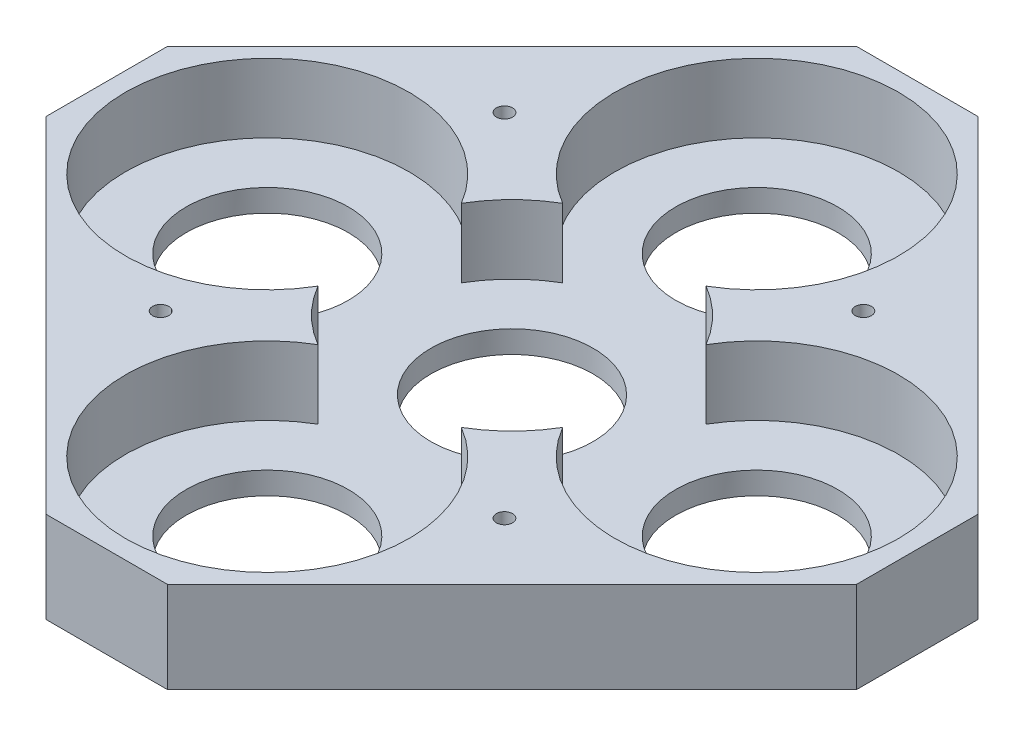
ISO-10303-21;
HEADER;
FILE_DESCRIPTION(('STEP AP214'),'2;1');
FILE_NAME('part.step','',(''),(''),'','','');
FILE_SCHEMA(('AUTOMOTIVE_DESIGN { 1 0 10303 214 1 1 1 1 }'));
ENDSEC;
DATA;
#1=APPLICATION_CONTEXT('core data for automotive mechanical design processes');
#2=APPLICATION_PROTOCOL_DEFINITION('international standard','automotive_design',2000,#1);
#3=PRODUCT_CONTEXT('',#1,'mechanical');
#4=PRODUCT('Part','Part','',(#3));
#5=PRODUCT_RELATED_PRODUCT_CATEGORY('part','',(#4));
#6=PRODUCT_DEFINITION_FORMATION('','',#4);
#7=PRODUCT_DEFINITION_CONTEXT('part definition',#1,'design');
#8=PRODUCT_DEFINITION('design','',#6,#7);
#9=PRODUCT_DEFINITION_SHAPE('','',#8);
#10=(LENGTH_UNIT() NAMED_UNIT(*) SI_UNIT(.MILLI.,.METRE.));
#11=(NAMED_UNIT(*) PLANE_ANGLE_UNIT() SI_UNIT($,.RADIAN.));
#12=(NAMED_UNIT(*) SI_UNIT($,.STERADIAN.) SOLID_ANGLE_UNIT());
#13=UNCERTAINTY_MEASURE_WITH_UNIT(LENGTH_MEASURE(1.E-05),#10,'distance_accuracy_value','');
#14=(GEOMETRIC_REPRESENTATION_CONTEXT(3) GLOBAL_UNCERTAINTY_ASSIGNED_CONTEXT((#13)) GLOBAL_UNIT_ASSIGNED_CONTEXT((#10,
#11,#12)) REPRESENTATION_CONTEXT('',''));
#15=CARTESIAN_POINT('',(0.,0.,0.));
#16=DIRECTION('',(0.,0.,1.));
#17=DIRECTION('',(1.,0.,0.));
#18=AXIS2_PLACEMENT_3D('',#15,#16,#17);
#19=CARTESIAN_POINT('',(0.,28.575,0.));
#20=DIRECTION('',(1.,0.,0.));
#21=DIRECTION('',(0.,0.,-1.));
#22=AXIS2_PLACEMENT_3D('',#19,#20,#21);
#23=PLANE('',#22);
#24=DIRECTION('',(0.,0.,1.));
#25=VECTOR('',#24,1.);
#26=CARTESIAN_POINT('',(0.,0.,0.));
#27=LINE('',#26,#25);
#28=CARTESIAN_POINT('',(0.,0.,-146.05));
#29=VERTEX_POINT('',#28);
#30=CARTESIAN_POINT('',(0.,0.,-107.95));
#31=VERTEX_POINT('',#30);
#32=EDGE_CURVE('E243',#29,#31,#27,.T.);
#33=ORIENTED_EDGE('',*,*,#32,.T.);
#34=DIRECTION('',(0.,1.,0.));
#35=VECTOR('',#34,1.);
#36=CARTESIAN_POINT('',(0.,28.575,-107.95));
#37=LINE('',#36,#35);
#38=CARTESIAN_POINT('',(0.,28.575,-107.95));
#39=VERTEX_POINT('',#38);
#40=EDGE_CURVE('E315',#31,#39,#37,.T.);
#41=ORIENTED_EDGE('',*,*,#40,.T.);
#42=DIRECTION('',(0.,0.,1.));
#43=VECTOR('',#42,1.);
#44=CARTESIAN_POINT('',(0.,28.575,0.));
#45=LINE('',#44,#43);
#46=CARTESIAN_POINT('',(0.,28.575,-146.05));
#47=VERTEX_POINT('',#46);
#48=EDGE_CURVE('E261',#47,#39,#45,.T.);
#49=ORIENTED_EDGE('',*,*,#48,.F.);
#50=DIRECTION('',(0.,-1.,0.));
#51=VECTOR('',#50,1.);
#52=CARTESIAN_POINT('',(0.,28.575,-146.05));
#53=LINE('',#52,#51);
#54=EDGE_CURVE('E311',#47,#29,#53,.T.);
#55=ORIENTED_EDGE('',*,*,#54,.T.);
#56=EDGE_LOOP('',(#33,#41,#49,#55));
#57=FACE_BOUND('',#56,.T.);
#58=ADVANCED_FACE('F43',(#57),#23,.F.);
#59=CARTESIAN_POINT('',(0.,28.575,0.));
#60=DIRECTION('',(0.,0.,-1.));
#61=DIRECTION('',(-1.,0.,0.));
#62=AXIS2_PLACEMENT_3D('',#59,#60,#61);
#63=PLANE('',#62);
#64=DIRECTION('',(1.,0.,0.));
#65=VECTOR('',#64,1.);
#66=CARTESIAN_POINT('',(0.,28.575,0.));
#67=LINE('',#66,#65);
#68=CARTESIAN_POINT('',(107.95,28.575,0.));
#69=VERTEX_POINT('',#68);
#70=CARTESIAN_POINT('',(146.05,28.575,0.));
#71=VERTEX_POINT('',#70);
#72=EDGE_CURVE('E265',#69,#71,#67,.T.);
#73=ORIENTED_EDGE('',*,*,#72,.F.);
#74=DIRECTION('',(0.,-1.,0.));
#75=VECTOR('',#74,1.);
#76=CARTESIAN_POINT('',(107.95,28.575,0.));
#77=LINE('',#76,#75);
#78=CARTESIAN_POINT('',(107.95,0.,0.));
#79=VERTEX_POINT('',#78);
#80=EDGE_CURVE('E295',#69,#79,#77,.T.);
#81=ORIENTED_EDGE('',*,*,#80,.T.);
#82=DIRECTION('',(1.,0.,0.));
#83=VECTOR('',#82,1.);
#84=CARTESIAN_POINT('',(0.,0.,0.));
#85=LINE('',#84,#83);
#86=CARTESIAN_POINT('',(146.05,0.,0.));
#87=VERTEX_POINT('',#86);
#88=EDGE_CURVE('E280',#79,#87,#85,.T.);
#89=ORIENTED_EDGE('',*,*,#88,.T.);
#90=DIRECTION('',(0.,1.,0.));
#91=VECTOR('',#90,1.);
#92=CARTESIAN_POINT('',(146.05,28.575,0.));
#93=LINE('',#92,#91);
#94=EDGE_CURVE('E276',#87,#71,#93,.T.);
#95=ORIENTED_EDGE('',*,*,#94,.T.);
#96=EDGE_LOOP('',(#73,#81,#89,#95));
#97=FACE_BOUND('',#96,.T.);
#98=ADVANCED_FACE('F367',(#97),#63,.F.);
#99=CARTESIAN_POINT('',(254.,28.575,0.));
#100=DIRECTION('',(-1.,0.,0.));
#101=DIRECTION('',(0.,0.,1.));
#102=AXIS2_PLACEMENT_3D('',#99,#100,#101);
#103=PLANE('',#102);
#104=DIRECTION('',(0.,0.,-1.));
#105=VECTOR('',#104,1.);
#106=CARTESIAN_POINT('',(254.,0.,0.));
#107=LINE('',#106,#105);
#108=CARTESIAN_POINT('',(254.,0.,-107.95));
#109=VERTEX_POINT('',#108);
#110=CARTESIAN_POINT('',(254.,0.,-146.05));
#111=VERTEX_POINT('',#110);
#112=EDGE_CURVE('E284',#109,#111,#107,.T.);
#113=ORIENTED_EDGE('',*,*,#112,.T.);
#114=DIRECTION('',(0.,1.,0.));
#115=VECTOR('',#114,1.);
#116=CARTESIAN_POINT('',(254.,28.575,-146.05));
#117=LINE('',#116,#115);
#118=CARTESIAN_POINT('',(254.,28.575,-146.05));
#119=VERTEX_POINT('',#118);
#120=EDGE_CURVE('E13',#111,#119,#117,.T.);
#121=ORIENTED_EDGE('',*,*,#120,.T.);
#122=DIRECTION('',(0.,0.,-1.));
#123=VECTOR('',#122,1.);
#124=CARTESIAN_POINT('',(254.,28.575,0.));
#125=LINE('',#124,#123);
#126=CARTESIAN_POINT('',(254.,28.575,-107.95));
#127=VERTEX_POINT('',#126);
#128=EDGE_CURVE('E270',#127,#119,#125,.T.);
#129=ORIENTED_EDGE('',*,*,#128,.F.);
#130=DIRECTION('',(0.,-1.,0.));
#131=VECTOR('',#130,1.);
#132=CARTESIAN_POINT('',(254.,28.575,-107.95));
#133=LINE('',#132,#131);
#134=EDGE_CURVE('E52',#127,#109,#133,.T.);
#135=ORIENTED_EDGE('',*,*,#134,.T.);
#136=EDGE_LOOP('',(#113,#121,#129,#135));
#137=FACE_BOUND('',#136,.T.);
#138=ADVANCED_FACE('F340',(#137),#103,.F.);
#139=CARTESIAN_POINT('',(0.,28.575,-254.));
#140=DIRECTION('',(0.,0.,1.));
#141=DIRECTION('',(1.,0.,0.));
#142=AXIS2_PLACEMENT_3D('',#139,#140,#141);
#143=PLANE('',#142);
#144=DIRECTION('',(-1.,0.,0.));
#145=VECTOR('',#144,1.);
#146=CARTESIAN_POINT('',(0.,0.,-254.));
#147=LINE('',#146,#145);
#148=CARTESIAN_POINT('',(146.05,0.,-254.));
#149=VERTEX_POINT('',#148);
#150=CARTESIAN_POINT('',(107.95,0.,-254.));
#151=VERTEX_POINT('',#150);
#152=EDGE_CURVE('E266',#149,#151,#147,.T.);
#153=ORIENTED_EDGE('',*,*,#152,.T.);
#154=DIRECTION('',(0.,1.,0.));
#155=VECTOR('',#154,1.);
#156=CARTESIAN_POINT('',(107.95,28.575,-254.));
#157=LINE('',#156,#155);
#158=CARTESIAN_POINT('',(107.95,28.575,-254.));
#159=VERTEX_POINT('',#158);
#160=EDGE_CURVE('E59',#151,#159,#157,.T.);
#161=ORIENTED_EDGE('',*,*,#160,.T.);
#162=DIRECTION('',(-1.,0.,0.));
#163=VECTOR('',#162,1.);
#164=CARTESIAN_POINT('',(0.,28.575,-254.));
#165=LINE('',#164,#163);
#166=CARTESIAN_POINT('',(146.05,28.575,-254.));
#167=VERTEX_POINT('',#166);
#168=EDGE_CURVE('E273',#167,#159,#165,.T.);
#169=ORIENTED_EDGE('',*,*,#168,.F.);
#170=DIRECTION('',(0.,-1.,0.));
#171=VECTOR('',#170,1.);
#172=CARTESIAN_POINT('',(146.05,28.575,-254.));
#173=LINE('',#172,#171);
#174=EDGE_CURVE('E329',#167,#149,#173,.T.);
#175=ORIENTED_EDGE('',*,*,#174,.T.);
#176=EDGE_LOOP('',(#153,#161,#169,#175));
#177=FACE_BOUND('',#176,.T.);
#178=ADVANCED_FACE('F351',(#177),#143,.F.);
#179=CARTESIAN_POINT('',(0.,28.575,0.));
#180=DIRECTION('',(0.,-1.,0.));
#181=DIRECTION('',(0.,0.,-1.));
#182=AXIS2_PLACEMENT_3D('',#179,#180,#181);
#183=PLANE('',#182);
#184=CARTESIAN_POINT('',(70.7525612106915,28.575,-180.881536726415));
#185=DIRECTION('',(0.,1.,0.));
#186=DIRECTION('',(0.,0.,1.));
#187=AXIS2_PLACEMENT_3D('',#184,#185,#186);
#188=CIRCLE('',#187,2.52729999999998);
#189=CARTESIAN_POINT('',(70.7525612106915,28.575,-178.354236726415));
#190=VERTEX_POINT('',#189);
#191=EDGE_CURVE('E756',#190,#190,#188,.T.);
#192=ORIENTED_EDGE('',*,*,#191,.F.);
#193=EDGE_LOOP('',(#192));
#194=FACE_BOUND('',#193,.T.);
#195=CARTESIAN_POINT('',(70.7525612106915,28.575,-73.1184632735851));
#196=DIRECTION('',(0.,1.,0.));
#197=DIRECTION('',(0.,0.,1.));
#198=AXIS2_PLACEMENT_3D('',#195,#196,#197);
#199=CIRCLE('',#198,2.52729999999998);
#200=CARTESIAN_POINT('',(70.7525612106915,28.575,-70.5911632735851));
#201=VERTEX_POINT('',#200);
#202=EDGE_CURVE('E748',#201,#201,#199,.T.);
#203=ORIENTED_EDGE('',*,*,#202,.F.);
#204=EDGE_LOOP('',(#203));
#205=FACE_BOUND('',#204,.T.);
#206=CARTESIAN_POINT('',(180.881536726415,28.575,-70.7525612106915));
#207=DIRECTION('',(0.,1.,0.));
#208=DIRECTION('',(0.,0.,1.));
#209=AXIS2_PLACEMENT_3D('',#206,#207,#208);
#210=CIRCLE('',#209,2.52729999999998);
#211=CARTESIAN_POINT('',(180.881536726415,28.575,-68.2252612106915));
#212=VERTEX_POINT('',#211);
#213=EDGE_CURVE('E740',#212,#212,#210,.T.);
#214=ORIENTED_EDGE('',*,*,#213,.F.);
#215=EDGE_LOOP('',(#214));
#216=FACE_BOUND('',#215,.T.);
#217=CARTESIAN_POINT('',(180.881536726415,28.575,-183.247438789308));
#218=DIRECTION('',(0.,1.,0.));
#219=DIRECTION('',(0.,0.,1.));
#220=AXIS2_PLACEMENT_3D('',#217,#218,#219);
#221=CIRCLE('',#220,2.52729999999998);
#222=CARTESIAN_POINT('',(180.881536726415,28.575,-180.720138789309));
#223=VERTEX_POINT('',#222);
#224=EDGE_CURVE('E730',#223,#223,#221,.T.);
#225=ORIENTED_EDGE('',*,*,#224,.F.);
#226=EDGE_LOOP('',(#225));
#227=FACE_BOUND('',#226,.T.);
#228=CARTESIAN_POINT('',(127.,28.575,-127.));
#229=DIRECTION('',(0.,1.,0.));
#230=DIRECTION('',(0.,0.,1.));
#231=AXIS2_PLACEMENT_3D('',#228,#229,#230);
#232=CIRCLE('',#231,44.45);
#233=CARTESIAN_POINT('',(165.354,28.575,-149.467157897696));
#234=VERTEX_POINT('',#233);
#235=CARTESIAN_POINT('',(149.467157897696,28.575,-165.354));
#236=VERTEX_POINT('',#235);
#237=EDGE_CURVE('E217',#234,#236,#232,.T.);
#238=ORIENTED_EDGE('',*,*,#237,.F.);
#239=CARTESIAN_POINT('',(203.708,28.575,-127.));
#240=DIRECTION('',(0.,1.,0.));
#241=DIRECTION('',(0.,0.,1.));
#242=AXIS2_PLACEMENT_3D('',#239,#240,#241);
#243=CIRCLE('',#242,44.45);
#244=CARTESIAN_POINT('',(165.354,28.575,-104.532842102304));
#245=VERTEX_POINT('',#244);
#246=EDGE_CURVE('E165',#245,#234,#243,.T.);
#247=ORIENTED_EDGE('',*,*,#246,.F.);
#248=CARTESIAN_POINT('',(127.,28.575,-127.));
#249=DIRECTION('',(0.,1.,0.));
#250=DIRECTION('',(0.,0.,1.));
#251=AXIS2_PLACEMENT_3D('',#248,#249,#250);
#252=CIRCLE('',#251,44.45);
#253=CARTESIAN_POINT('',(149.467157897696,28.575,-88.646));
#254=VERTEX_POINT('',#253);
#255=EDGE_CURVE('E186',#254,#245,#252,.T.);
#256=ORIENTED_EDGE('',*,*,#255,.F.);
#257=CARTESIAN_POINT('',(127.,28.575,-50.292));
#258=DIRECTION('',(0.,1.,0.));
#259=DIRECTION('',(0.,0.,1.));
#260=AXIS2_PLACEMENT_3D('',#257,#258,#259);
#261=CIRCLE('',#260,44.45);
#262=CARTESIAN_POINT('',(104.532842102304,28.575,-88.646));
#263=VERTEX_POINT('',#262);
#264=EDGE_CURVE('E190',#263,#254,#261,.T.);
#265=ORIENTED_EDGE('',*,*,#264,.F.);
#266=CARTESIAN_POINT('',(127.,28.575,-127.));
#267=DIRECTION('',(0.,1.,0.));
#268=DIRECTION('',(0.,0.,1.));
#269=AXIS2_PLACEMENT_3D('',#266,#267,#268);
#270=CIRCLE('',#269,44.45);
#271=CARTESIAN_POINT('',(88.646,28.575,-104.532842102304));
#272=VERTEX_POINT('',#271);
#273=EDGE_CURVE('E233',#272,#263,#270,.T.);
#274=ORIENTED_EDGE('',*,*,#273,.F.);
#275=CARTESIAN_POINT('',(50.292,28.575,-127.));
#276=DIRECTION('',(0.,1.,0.));
#277=DIRECTION('',(0.,0.,1.));
#278=AXIS2_PLACEMENT_3D('',#275,#276,#277);
#279=CIRCLE('',#278,44.45);
#280=CARTESIAN_POINT('',(88.646,28.575,-149.467157897696));
#281=VERTEX_POINT('',#280);
#282=EDGE_CURVE('E229',#281,#272,#279,.T.);
#283=ORIENTED_EDGE('',*,*,#282,.F.);
#284=CARTESIAN_POINT('',(127.,28.575,-127.));
#285=DIRECTION('',(0.,1.,0.));
#286=DIRECTION('',(0.,0.,1.));
#287=AXIS2_PLACEMENT_3D('',#284,#285,#286);
#288=CIRCLE('',#287,44.45);
#289=CARTESIAN_POINT('',(104.532842102304,28.575,-165.354));
#290=VERTEX_POINT('',#289);
#291=EDGE_CURVE('E225',#290,#281,#288,.T.);
#292=ORIENTED_EDGE('',*,*,#291,.F.);
#293=CARTESIAN_POINT('',(127.,28.575,-203.708));
#294=DIRECTION('',(0.,1.,0.));
#295=DIRECTION('',(0.,0.,1.));
#296=AXIS2_PLACEMENT_3D('',#293,#294,#295);
#297=CIRCLE('',#296,44.45);
#298=EDGE_CURVE('E221',#236,#290,#297,.T.);
#299=ORIENTED_EDGE('',*,*,#298,.F.);
#300=EDGE_LOOP('',(#238,#247,#256,#265,#274,#283,#292,#299));
#301=FACE_BOUND('',#300,.T.);
#302=ORIENTED_EDGE('',*,*,#48,.T.);
#303=DIRECTION('',(-0.707106781186548,0.,-0.707106781186548));
#304=VECTOR('',#303,1.);
#305=CARTESIAN_POINT('',(107.95,28.575,0.));
#306=LINE('',#305,#304);
#307=EDGE_CURVE('E326',#39,#69,#306,.F.);
#308=ORIENTED_EDGE('',*,*,#307,.T.);
#309=ORIENTED_EDGE('',*,*,#72,.T.);
#310=DIRECTION('',(-0.707106781186548,0.,0.707106781186548));
#311=VECTOR('',#310,1.);
#312=CARTESIAN_POINT('',(254.,28.575,-107.95));
#313=LINE('',#312,#311);
#314=EDGE_CURVE('E318',#71,#127,#313,.F.);
#315=ORIENTED_EDGE('',*,*,#314,.T.);
#316=ORIENTED_EDGE('',*,*,#128,.T.);
#317=DIRECTION('',(0.707106781186548,0.,0.707106781186548));
#318=VECTOR('',#317,1.);
#319=CARTESIAN_POINT('',(146.05,28.575,-254.));
#320=LINE('',#319,#318);
#321=EDGE_CURVE('E66',#119,#167,#320,.F.);
#322=ORIENTED_EDGE('',*,*,#321,.T.);
#323=ORIENTED_EDGE('',*,*,#168,.T.);
#324=DIRECTION('',(0.707106781186548,0.,-0.707106781186548));
#325=VECTOR('',#324,1.);
#326=CARTESIAN_POINT('',(0.,28.575,-146.05));
#327=LINE('',#326,#325);
#328=EDGE_CURVE('E323',#159,#47,#327,.F.);
#329=ORIENTED_EDGE('',*,*,#328,.T.);
#330=EDGE_LOOP('',(#302,#308,#309,#315,#316,#322,#323,#329));
#331=FACE_BOUND('',#330,.T.);
#332=ADVANCED_FACE('F353',(#194,#205,#216,#227,#301,#331),#183,.F.);
#333=CARTESIAN_POINT('',(0.,0.,0.));
#334=DIRECTION('',(0.,-1.,0.));
#335=DIRECTION('',(0.,0.,-1.));
#336=AXIS2_PLACEMENT_3D('',#333,#334,#335);
#337=PLANE('',#336);
#338=CARTESIAN_POINT('',(70.7525612106915,0.,-180.881536726415));
#339=DIRECTION('',(0.,1.,0.));
#340=DIRECTION('',(0.,0.,1.));
#341=AXIS2_PLACEMENT_3D('',#338,#339,#340);
#342=CIRCLE('',#341,2.5273);
#343=CARTESIAN_POINT('',(70.7525612106915,0.,-178.354236726415));
#344=VERTEX_POINT('',#343);
#345=EDGE_CURVE('E752',#344,#344,#342,.T.);
#346=ORIENTED_EDGE('',*,*,#345,.T.);
#347=EDGE_LOOP('',(#346));
#348=FACE_BOUND('',#347,.T.);
#349=CARTESIAN_POINT('',(70.7525612106915,0.,-73.1184632735851));
#350=DIRECTION('',(0.,1.,0.));
#351=DIRECTION('',(0.,0.,1.));
#352=AXIS2_PLACEMENT_3D('',#349,#350,#351);
#353=CIRCLE('',#352,2.5273);
#354=CARTESIAN_POINT('',(70.7525612106915,0.,-70.5911632735851));
#355=VERTEX_POINT('',#354);
#356=EDGE_CURVE('E744',#355,#355,#353,.T.);
#357=ORIENTED_EDGE('',*,*,#356,.T.);
#358=EDGE_LOOP('',(#357));
#359=FACE_BOUND('',#358,.T.);
#360=CARTESIAN_POINT('',(180.881536726415,0.,-70.7525612106915));
#361=DIRECTION('',(0.,1.,0.));
#362=DIRECTION('',(0.,0.,1.));
#363=AXIS2_PLACEMENT_3D('',#360,#361,#362);
#364=CIRCLE('',#363,2.52729999999998);
#365=CARTESIAN_POINT('',(180.881536726415,0.,-68.2252612106915));
#366=VERTEX_POINT('',#365);
#367=EDGE_CURVE('E736',#366,#366,#364,.T.);
#368=ORIENTED_EDGE('',*,*,#367,.T.);
#369=EDGE_LOOP('',(#368));
#370=FACE_BOUND('',#369,.T.);
#371=CARTESIAN_POINT('',(180.881536726415,0.,-183.247438789308));
#372=DIRECTION('',(0.,1.,0.));
#373=DIRECTION('',(0.,0.,1.));
#374=AXIS2_PLACEMENT_3D('',#371,#372,#373);
#375=CIRCLE('',#374,2.52729999999998);
#376=CARTESIAN_POINT('',(180.881536726415,0.,-180.720138789309));
#377=VERTEX_POINT('',#376);
#378=EDGE_CURVE('E724',#377,#377,#375,.T.);
#379=ORIENTED_EDGE('',*,*,#378,.T.);
#380=EDGE_LOOP('',(#379));
#381=FACE_BOUND('',#380,.T.);
#382=CARTESIAN_POINT('',(127.,0.,-50.292));
#383=DIRECTION('',(0.,-1.,0.));
#384=DIRECTION('',(0.,0.,-1.));
#385=AXIS2_PLACEMENT_3D('',#382,#383,#384);
#386=CIRCLE('',#385,25.4);
#387=CARTESIAN_POINT('',(127.,0.,-75.692));
#388=VERTEX_POINT('',#387);
#389=EDGE_CURVE('E193',#388,#388,#386,.T.);
#390=ORIENTED_EDGE('',*,*,#389,.F.);
#391=EDGE_LOOP('',(#390));
#392=FACE_BOUND('',#391,.T.);
#393=CARTESIAN_POINT('',(50.292,0.,-127.));
#394=DIRECTION('',(0.,-1.,0.));
#395=DIRECTION('',(0.,0.,-1.));
#396=AXIS2_PLACEMENT_3D('',#393,#394,#395);
#397=CIRCLE('',#396,25.4);
#398=CARTESIAN_POINT('',(50.292,0.,-152.4));
#399=VERTEX_POINT('',#398);
#400=EDGE_CURVE('E706',#399,#399,#397,.T.);
#401=ORIENTED_EDGE('',*,*,#400,.F.);
#402=EDGE_LOOP('',(#401));
#403=FACE_BOUND('',#402,.T.);
#404=CARTESIAN_POINT('',(127.,0.,-203.708));
#405=DIRECTION('',(0.,-1.,0.));
#406=DIRECTION('',(0.,0.,-1.));
#407=AXIS2_PLACEMENT_3D('',#404,#405,#406);
#408=CIRCLE('',#407,25.4);
#409=CARTESIAN_POINT('',(127.,0.,-229.108));
#410=VERTEX_POINT('',#409);
#411=EDGE_CURVE('E699',#410,#410,#408,.T.);
#412=ORIENTED_EDGE('',*,*,#411,.F.);
#413=EDGE_LOOP('',(#412));
#414=FACE_BOUND('',#413,.T.);
#415=CARTESIAN_POINT('',(203.708,0.,-127.));
#416=DIRECTION('',(0.,-1.,0.));
#417=DIRECTION('',(0.,0.,-1.));
#418=AXIS2_PLACEMENT_3D('',#415,#416,#417);
#419=CIRCLE('',#418,25.4);
#420=CARTESIAN_POINT('',(203.708,0.,-152.4));
#421=VERTEX_POINT('',#420);
#422=EDGE_CURVE('E218',#421,#421,#419,.T.);
#423=ORIENTED_EDGE('',*,*,#422,.F.);
#424=EDGE_LOOP('',(#423));
#425=FACE_BOUND('',#424,.T.);
#426=CARTESIAN_POINT('',(127.,0.,-127.));
#427=DIRECTION('',(0.,-1.,0.));
#428=DIRECTION('',(0.,0.,-1.));
#429=AXIS2_PLACEMENT_3D('',#426,#427,#428);
#430=CIRCLE('',#429,25.4);
#431=CARTESIAN_POINT('',(127.,0.,-152.4));
#432=VERTEX_POINT('',#431);
#433=EDGE_CURVE('E694',#432,#432,#430,.T.);
#434=ORIENTED_EDGE('',*,*,#433,.F.);
#435=EDGE_LOOP('',(#434));
#436=FACE_BOUND('',#435,.T.);
#437=ORIENTED_EDGE('',*,*,#88,.F.);
#438=DIRECTION('',(0.707106781186548,0.,0.707106781186548));
#439=VECTOR('',#438,1.);
#440=CARTESIAN_POINT('',(53.975,0.,-53.975));
#441=LINE('',#440,#439);
#442=EDGE_CURVE('E308',#79,#31,#441,.F.);
#443=ORIENTED_EDGE('',*,*,#442,.T.);
#444=ORIENTED_EDGE('',*,*,#32,.F.);
#445=DIRECTION('',(-0.707106781186548,0.,0.707106781186548));
#446=VECTOR('',#445,1.);
#447=CARTESIAN_POINT('',(-73.025,0.,-73.025));
#448=LINE('',#447,#446);
#449=EDGE_CURVE('E305',#29,#151,#448,.F.);
#450=ORIENTED_EDGE('',*,*,#449,.T.);
#451=ORIENTED_EDGE('',*,*,#152,.F.);
#452=DIRECTION('',(-0.707106781186548,0.,-0.707106781186548));
#453=VECTOR('',#452,1.);
#454=CARTESIAN_POINT('',(200.025,0.,-200.025));
#455=LINE('',#454,#453);
#456=EDGE_CURVE('E302',#149,#111,#455,.F.);
#457=ORIENTED_EDGE('',*,*,#456,.T.);
#458=ORIENTED_EDGE('',*,*,#112,.F.);
#459=DIRECTION('',(0.707106781186548,0.,-0.707106781186548));
#460=VECTOR('',#459,1.);
#461=CARTESIAN_POINT('',(73.025,0.,73.025));
#462=LINE('',#461,#460);
#463=EDGE_CURVE('E299',#109,#87,#462,.F.);
#464=ORIENTED_EDGE('',*,*,#463,.T.);
#465=EDGE_LOOP('',(#437,#443,#444,#450,#451,#457,#458,#464));
#466=FACE_BOUND('',#465,.T.);
#467=ADVANCED_FACE('F346',(#348,#359,#370,#381,#392,#403,#414,#425,#436,#466),#337,.T.);
#468=CARTESIAN_POINT('',(203.708,6.985,-127.));
#469=DIRECTION('',(0.,1.,0.));
#470=DIRECTION('',(0.,0.,1.));
#471=AXIS2_PLACEMENT_3D('',#468,#469,#470);
#472=CYLINDRICAL_SURFACE('',#471,44.45);
#473=ORIENTED_EDGE('',*,*,#246,.T.);
#474=DIRECTION('',(0.,1.,0.));
#475=VECTOR('',#474,1.);
#476=CARTESIAN_POINT('',(165.354,6.985,-149.467157897696));
#477=LINE('',#476,#475);
#478=CARTESIAN_POINT('',(165.354,6.985,-149.467157897696));
#479=VERTEX_POINT('',#478);
#480=EDGE_CURVE('E158',#479,#234,#477,.T.);
#481=ORIENTED_EDGE('',*,*,#480,.F.);
#482=CARTESIAN_POINT('',(203.708,6.985,-127.));
#483=DIRECTION('',(0.,1.,0.));
#484=DIRECTION('',(0.,0.,1.));
#485=AXIS2_PLACEMENT_3D('',#482,#483,#484);
#486=CIRCLE('',#485,44.45);
#487=CARTESIAN_POINT('',(165.354,6.985,-104.532842102304));
#488=VERTEX_POINT('',#487);
#489=EDGE_CURVE('E162',#488,#479,#486,.T.);
#490=ORIENTED_EDGE('',*,*,#489,.F.);
#491=DIRECTION('',(0.,1.,0.));
#492=VECTOR('',#491,1.);
#493=CARTESIAN_POINT('',(165.354,6.985,-104.532842102304));
#494=LINE('',#493,#492);
#495=EDGE_CURVE('E240',#488,#245,#494,.T.);
#496=ORIENTED_EDGE('',*,*,#495,.T.);
#497=EDGE_LOOP('',(#473,#481,#490,#496));
#498=FACE_BOUND('',#497,.T.);
#499=ADVANCED_FACE('F160',(#498),#472,.F.);
#500=CARTESIAN_POINT('',(127.,6.985,-127.));
#501=DIRECTION('',(0.,1.,0.));
#502=DIRECTION('',(0.,0.,1.));
#503=AXIS2_PLACEMENT_3D('',#500,#501,#502);
#504=CYLINDRICAL_SURFACE('',#503,44.45);
#505=ORIENTED_EDGE('',*,*,#255,.T.);
#506=ORIENTED_EDGE('',*,*,#495,.F.);
#507=CARTESIAN_POINT('',(127.,6.985,-127.));
#508=DIRECTION('',(0.,1.,0.));
#509=DIRECTION('',(0.,0.,1.));
#510=AXIS2_PLACEMENT_3D('',#507,#508,#509);
#511=CIRCLE('',#510,44.45);
#512=CARTESIAN_POINT('',(149.467157897696,6.985,-88.646));
#513=VERTEX_POINT('',#512);
#514=EDGE_CURVE('E171',#513,#488,#511,.T.);
#515=ORIENTED_EDGE('',*,*,#514,.F.);
#516=DIRECTION('',(0.,1.,0.));
#517=VECTOR('',#516,1.);
#518=CARTESIAN_POINT('',(149.467157897696,6.985,-88.646));
#519=LINE('',#518,#517);
#520=EDGE_CURVE('E244',#513,#254,#519,.T.);
#521=ORIENTED_EDGE('',*,*,#520,.T.);
#522=EDGE_LOOP('',(#505,#506,#515,#521));
#523=FACE_BOUND('',#522,.T.);
#524=ADVANCED_FACE('F488',(#523),#504,.F.);
#525=CARTESIAN_POINT('',(127.,6.985,-50.292));
#526=DIRECTION('',(0.,1.,0.));
#527=DIRECTION('',(0.,0.,1.));
#528=AXIS2_PLACEMENT_3D('',#525,#526,#527);
#529=CYLINDRICAL_SURFACE('',#528,44.45);
#530=ORIENTED_EDGE('',*,*,#264,.T.);
#531=ORIENTED_EDGE('',*,*,#520,.F.);
#532=CARTESIAN_POINT('',(127.,6.985,-50.292));
#533=DIRECTION('',(0.,1.,0.));
#534=DIRECTION('',(0.,0.,1.));
#535=AXIS2_PLACEMENT_3D('',#532,#533,#534);
#536=CIRCLE('',#535,44.45);
#537=CARTESIAN_POINT('',(104.532842102304,6.985,-88.646));
#538=VERTEX_POINT('',#537);
#539=EDGE_CURVE('E210',#538,#513,#536,.T.);
#540=ORIENTED_EDGE('',*,*,#539,.F.);
#541=DIRECTION('',(0.,1.,0.));
#542=VECTOR('',#541,1.);
#543=CARTESIAN_POINT('',(104.532842102304,6.985,-88.646));
#544=LINE('',#543,#542);
#545=EDGE_CURVE('E247',#538,#263,#544,.T.);
#546=ORIENTED_EDGE('',*,*,#545,.T.);
#547=EDGE_LOOP('',(#530,#531,#540,#546));
#548=FACE_BOUND('',#547,.T.);
#549=ADVANCED_FACE('F491',(#548),#529,.F.);
#550=CARTESIAN_POINT('',(127.,6.985,-127.));
#551=DIRECTION('',(0.,1.,0.));
#552=DIRECTION('',(0.,0.,1.));
#553=AXIS2_PLACEMENT_3D('',#550,#551,#552);
#554=CYLINDRICAL_SURFACE('',#553,44.45);
#555=ORIENTED_EDGE('',*,*,#273,.T.);
#556=ORIENTED_EDGE('',*,*,#545,.F.);
#557=CARTESIAN_POINT('',(127.,6.985,-127.));
#558=DIRECTION('',(0.,1.,0.));
#559=DIRECTION('',(0.,0.,1.));
#560=AXIS2_PLACEMENT_3D('',#557,#558,#559);
#561=CIRCLE('',#560,44.45);
#562=CARTESIAN_POINT('',(88.646,6.985,-104.532842102304));
#563=VERTEX_POINT('',#562);
#564=EDGE_CURVE('E206',#563,#538,#561,.T.);
#565=ORIENTED_EDGE('',*,*,#564,.F.);
#566=DIRECTION('',(0.,1.,0.));
#567=VECTOR('',#566,1.);
#568=CARTESIAN_POINT('',(88.646,6.985,-104.532842102304));
#569=LINE('',#568,#567);
#570=EDGE_CURVE('E250',#563,#272,#569,.T.);
#571=ORIENTED_EDGE('',*,*,#570,.T.);
#572=EDGE_LOOP('',(#555,#556,#565,#571));
#573=FACE_BOUND('',#572,.T.);
#574=ADVANCED_FACE('F495',(#573),#554,.F.);
#575=CARTESIAN_POINT('',(50.292,6.985,-127.));
#576=DIRECTION('',(0.,1.,0.));
#577=DIRECTION('',(0.,0.,1.));
#578=AXIS2_PLACEMENT_3D('',#575,#576,#577);
#579=CYLINDRICAL_SURFACE('',#578,44.45);
#580=ORIENTED_EDGE('',*,*,#282,.T.);
#581=ORIENTED_EDGE('',*,*,#570,.F.);
#582=CARTESIAN_POINT('',(50.292,6.985,-127.));
#583=DIRECTION('',(0.,1.,0.));
#584=DIRECTION('',(0.,0.,1.));
#585=AXIS2_PLACEMENT_3D('',#582,#583,#584);
#586=CIRCLE('',#585,44.45);
#587=CARTESIAN_POINT('',(88.646,6.985,-149.467157897696));
#588=VERTEX_POINT('',#587);
#589=EDGE_CURVE('E202',#588,#563,#586,.T.);
#590=ORIENTED_EDGE('',*,*,#589,.F.);
#591=DIRECTION('',(0.,1.,0.));
#592=VECTOR('',#591,1.);
#593=CARTESIAN_POINT('',(88.646,6.985,-149.467157897696));
#594=LINE('',#593,#592);
#595=EDGE_CURVE('E253',#588,#281,#594,.T.);
#596=ORIENTED_EDGE('',*,*,#595,.T.);
#597=EDGE_LOOP('',(#580,#581,#590,#596));
#598=FACE_BOUND('',#597,.T.);
#599=ADVANCED_FACE('F499',(#598),#579,.F.);
#600=CARTESIAN_POINT('',(127.,6.985,-127.));
#601=DIRECTION('',(0.,1.,0.));
#602=DIRECTION('',(0.,0.,1.));
#603=AXIS2_PLACEMENT_3D('',#600,#601,#602);
#604=CYLINDRICAL_SURFACE('',#603,44.45);
#605=ORIENTED_EDGE('',*,*,#291,.T.);
#606=ORIENTED_EDGE('',*,*,#595,.F.);
#607=CARTESIAN_POINT('',(127.,6.985,-127.));
#608=DIRECTION('',(0.,1.,0.));
#609=DIRECTION('',(0.,0.,1.));
#610=AXIS2_PLACEMENT_3D('',#607,#608,#609);
#611=CIRCLE('',#610,44.45);
#612=CARTESIAN_POINT('',(104.532842102304,6.985,-165.354));
#613=VERTEX_POINT('',#612);
#614=EDGE_CURVE('E198',#613,#588,#611,.T.);
#615=ORIENTED_EDGE('',*,*,#614,.F.);
#616=DIRECTION('',(0.,1.,0.));
#617=VECTOR('',#616,1.);
#618=CARTESIAN_POINT('',(104.532842102304,6.985,-165.354));
#619=LINE('',#618,#617);
#620=EDGE_CURVE('E256',#613,#290,#619,.T.);
#621=ORIENTED_EDGE('',*,*,#620,.T.);
#622=EDGE_LOOP('',(#605,#606,#615,#621));
#623=FACE_BOUND('',#622,.T.);
#624=ADVANCED_FACE('F503',(#623),#604,.F.);
#625=CARTESIAN_POINT('',(127.,6.985,-203.708));
#626=DIRECTION('',(0.,1.,0.));
#627=DIRECTION('',(0.,0.,1.));
#628=AXIS2_PLACEMENT_3D('',#625,#626,#627);
#629=CYLINDRICAL_SURFACE('',#628,44.45);
#630=ORIENTED_EDGE('',*,*,#298,.T.);
#631=ORIENTED_EDGE('',*,*,#620,.F.);
#632=CARTESIAN_POINT('',(127.,6.985,-203.708));
#633=DIRECTION('',(0.,1.,0.));
#634=DIRECTION('',(0.,0.,1.));
#635=AXIS2_PLACEMENT_3D('',#632,#633,#634);
#636=CIRCLE('',#635,44.45);
#637=CARTESIAN_POINT('',(149.467157897696,6.985,-165.354));
#638=VERTEX_POINT('',#637);
#639=EDGE_CURVE('E180',#638,#613,#636,.T.);
#640=ORIENTED_EDGE('',*,*,#639,.F.);
#641=DIRECTION('',(0.,1.,0.));
#642=VECTOR('',#641,1.);
#643=CARTESIAN_POINT('',(149.467157897696,6.985,-165.354));
#644=LINE('',#643,#642);
#645=EDGE_CURVE('E170',#638,#236,#644,.T.);
#646=ORIENTED_EDGE('',*,*,#645,.T.);
#647=EDGE_LOOP('',(#630,#631,#640,#646));
#648=FACE_BOUND('',#647,.T.);
#649=ADVANCED_FACE('F507',(#648),#629,.F.);
#650=CARTESIAN_POINT('',(127.,6.985,-127.));
#651=DIRECTION('',(0.,1.,0.));
#652=DIRECTION('',(0.,0.,1.));
#653=AXIS2_PLACEMENT_3D('',#650,#651,#652);
#654=CYLINDRICAL_SURFACE('',#653,44.45);
#655=ORIENTED_EDGE('',*,*,#237,.T.);
#656=ORIENTED_EDGE('',*,*,#645,.F.);
#657=CARTESIAN_POINT('',(127.,6.985,-127.));
#658=DIRECTION('',(0.,1.,0.));
#659=DIRECTION('',(0.,0.,1.));
#660=AXIS2_PLACEMENT_3D('',#657,#658,#659);
#661=CIRCLE('',#660,44.45);
#662=EDGE_CURVE('E174',#479,#638,#661,.T.);
#663=ORIENTED_EDGE('',*,*,#662,.F.);
#664=ORIENTED_EDGE('',*,*,#480,.T.);
#665=EDGE_LOOP('',(#655,#656,#663,#664));
#666=FACE_BOUND('',#665,.T.);
#667=ADVANCED_FACE('F175',(#666),#654,.F.);
#668=CARTESIAN_POINT('',(0.,6.985,0.));
#669=DIRECTION('',(0.,1.,0.));
#670=DIRECTION('',(0.,0.,1.));
#671=AXIS2_PLACEMENT_3D('',#668,#669,#670);
#672=PLANE('',#671);
#673=CARTESIAN_POINT('',(203.708,6.985,-127.));
#674=DIRECTION('',(0.,1.,0.));
#675=DIRECTION('',(0.,0.,1.));
#676=AXIS2_PLACEMENT_3D('',#673,#674,#675);
#677=CIRCLE('',#676,25.4);
#678=CARTESIAN_POINT('',(203.708,6.985,-101.6));
#679=VERTEX_POINT('',#678);
#680=EDGE_CURVE('E676',#679,#679,#677,.T.);
#681=ORIENTED_EDGE('',*,*,#680,.F.);
#682=EDGE_LOOP('',(#681));
#683=FACE_BOUND('',#682,.T.);
#684=CARTESIAN_POINT('',(127.,6.985,-50.292));
#685=DIRECTION('',(0.,1.,0.));
#686=DIRECTION('',(0.,0.,1.));
#687=AXIS2_PLACEMENT_3D('',#684,#685,#686);
#688=CIRCLE('',#687,25.4);
#689=CARTESIAN_POINT('',(127.,6.985,-24.892));
#690=VERTEX_POINT('',#689);
#691=EDGE_CURVE('E680',#690,#690,#688,.T.);
#692=ORIENTED_EDGE('',*,*,#691,.F.);
#693=EDGE_LOOP('',(#692));
#694=FACE_BOUND('',#693,.T.);
#695=CARTESIAN_POINT('',(50.292,6.985,-127.));
#696=DIRECTION('',(0.,1.,0.));
#697=DIRECTION('',(0.,0.,1.));
#698=AXIS2_PLACEMENT_3D('',#695,#696,#697);
#699=CIRCLE('',#698,25.4);
#700=CARTESIAN_POINT('',(50.292,6.985,-101.6));
#701=VERTEX_POINT('',#700);
#702=EDGE_CURVE('E684',#701,#701,#699,.T.);
#703=ORIENTED_EDGE('',*,*,#702,.F.);
#704=EDGE_LOOP('',(#703));
#705=FACE_BOUND('',#704,.T.);
#706=CARTESIAN_POINT('',(127.,6.985,-203.708));
#707=DIRECTION('',(0.,1.,0.));
#708=DIRECTION('',(0.,0.,1.));
#709=AXIS2_PLACEMENT_3D('',#706,#707,#708);
#710=CIRCLE('',#709,25.4);
#711=CARTESIAN_POINT('',(127.,6.985,-178.308));
#712=VERTEX_POINT('',#711);
#713=EDGE_CURVE('E688',#712,#712,#710,.T.);
#714=ORIENTED_EDGE('',*,*,#713,.F.);
#715=EDGE_LOOP('',(#714));
#716=FACE_BOUND('',#715,.T.);
#717=CARTESIAN_POINT('',(127.,6.985,-127.));
#718=DIRECTION('',(0.,1.,0.));
#719=DIRECTION('',(0.,0.,1.));
#720=AXIS2_PLACEMENT_3D('',#717,#718,#719);
#721=CIRCLE('',#720,25.4);
#722=CARTESIAN_POINT('',(127.,6.985,-101.6));
#723=VERTEX_POINT('',#722);
#724=EDGE_CURVE('E691',#723,#723,#721,.T.);
#725=ORIENTED_EDGE('',*,*,#724,.F.);
#726=EDGE_LOOP('',(#725));
#727=FACE_BOUND('',#726,.T.);
#728=ORIENTED_EDGE('',*,*,#489,.T.);
#729=ORIENTED_EDGE('',*,*,#662,.T.);
#730=ORIENTED_EDGE('',*,*,#639,.T.);
#731=ORIENTED_EDGE('',*,*,#614,.T.);
#732=ORIENTED_EDGE('',*,*,#589,.T.);
#733=ORIENTED_EDGE('',*,*,#564,.T.);
#734=ORIENTED_EDGE('',*,*,#539,.T.);
#735=ORIENTED_EDGE('',*,*,#514,.T.);
#736=EDGE_LOOP('',(#728,#729,#730,#731,#732,#733,#734,#735));
#737=FACE_BOUND('',#736,.T.);
#738=ADVANCED_FACE('F182',(#683,#694,#705,#716,#727,#737),#672,.T.);
#739=CARTESIAN_POINT('',(127.,-9.525,-127.));
#740=DIRECTION('',(0.,1.,0.));
#741=DIRECTION('',(0.,0.,1.));
#742=AXIS2_PLACEMENT_3D('',#739,#740,#741);
#743=CYLINDRICAL_SURFACE('',#742,25.4);
#744=ORIENTED_EDGE('',*,*,#433,.T.);
#745=EDGE_LOOP('',(#744));
#746=FACE_BOUND('',#745,.T.);
#747=ORIENTED_EDGE('',*,*,#724,.T.);
#748=EDGE_LOOP('',(#747));
#749=FACE_BOUND('',#748,.T.);
#750=ADVANCED_FACE('F471',(#746,#749),#743,.F.);
#751=CARTESIAN_POINT('',(127.,-9.525,-203.708));
#752=DIRECTION('',(0.,1.,0.));
#753=DIRECTION('',(0.,0.,1.));
#754=AXIS2_PLACEMENT_3D('',#751,#752,#753);
#755=CYLINDRICAL_SURFACE('',#754,25.4);
#756=ORIENTED_EDGE('',*,*,#411,.T.);
#757=EDGE_LOOP('',(#756));
#758=FACE_BOUND('',#757,.T.);
#759=ORIENTED_EDGE('',*,*,#713,.T.);
#760=EDGE_LOOP('',(#759));
#761=FACE_BOUND('',#760,.T.);
#762=ADVANCED_FACE('F467',(#758,#761),#755,.F.);
#763=CARTESIAN_POINT('',(50.292,-9.525,-127.));
#764=DIRECTION('',(0.,1.,0.));
#765=DIRECTION('',(0.,0.,1.));
#766=AXIS2_PLACEMENT_3D('',#763,#764,#765);
#767=CYLINDRICAL_SURFACE('',#766,25.4);
#768=ORIENTED_EDGE('',*,*,#400,.T.);
#769=EDGE_LOOP('',(#768));
#770=FACE_BOUND('',#769,.T.);
#771=ORIENTED_EDGE('',*,*,#702,.T.);
#772=EDGE_LOOP('',(#771));
#773=FACE_BOUND('',#772,.T.);
#774=ADVANCED_FACE('F470',(#770,#773),#767,.F.);
#775=CARTESIAN_POINT('',(127.,-9.525,-50.292));
#776=DIRECTION('',(0.,1.,0.));
#777=DIRECTION('',(0.,0.,1.));
#778=AXIS2_PLACEMENT_3D('',#775,#776,#777);
#779=CYLINDRICAL_SURFACE('',#778,25.4);
#780=ORIENTED_EDGE('',*,*,#389,.T.);
#781=EDGE_LOOP('',(#780));
#782=FACE_BOUND('',#781,.T.);
#783=ORIENTED_EDGE('',*,*,#691,.T.);
#784=EDGE_LOOP('',(#783));
#785=FACE_BOUND('',#784,.T.);
#786=ADVANCED_FACE('F474',(#782,#785),#779,.F.);
#787=CARTESIAN_POINT('',(203.708,-9.525,-127.));
#788=DIRECTION('',(0.,1.,0.));
#789=DIRECTION('',(0.,0.,1.));
#790=AXIS2_PLACEMENT_3D('',#787,#788,#789);
#791=CYLINDRICAL_SURFACE('',#790,25.4);
#792=ORIENTED_EDGE('',*,*,#422,.T.);
#793=EDGE_LOOP('',(#792));
#794=FACE_BOUND('',#793,.T.);
#795=ORIENTED_EDGE('',*,*,#680,.T.);
#796=EDGE_LOOP('',(#795));
#797=FACE_BOUND('',#796,.T.);
#798=ADVANCED_FACE('F388',(#794,#797),#791,.F.);
#799=CARTESIAN_POINT('',(107.95,28.575,0.));
#800=DIRECTION('',(0.707106781186547,0.,-0.707106781186547));
#801=DIRECTION('',(0.,-1.,0.));
#802=AXIS2_PLACEMENT_3D('',#799,#800,#801);
#803=PLANE('',#802);
#804=ORIENTED_EDGE('',*,*,#307,.F.);
#805=ORIENTED_EDGE('',*,*,#40,.F.);
#806=ORIENTED_EDGE('',*,*,#442,.F.);
#807=ORIENTED_EDGE('',*,*,#80,.F.);
#808=EDGE_LOOP('',(#804,#805,#806,#807));
#809=FACE_BOUND('',#808,.T.);
#810=ADVANCED_FACE('F364',(#809),#803,.F.);
#811=CARTESIAN_POINT('',(0.,28.575,-146.05));
#812=DIRECTION('',(0.707106781186547,0.,0.707106781186547));
#813=DIRECTION('',(0.,-1.,0.));
#814=AXIS2_PLACEMENT_3D('',#811,#812,#813);
#815=PLANE('',#814);
#816=ORIENTED_EDGE('',*,*,#328,.F.);
#817=ORIENTED_EDGE('',*,*,#160,.F.);
#818=ORIENTED_EDGE('',*,*,#449,.F.);
#819=ORIENTED_EDGE('',*,*,#54,.F.);
#820=EDGE_LOOP('',(#816,#817,#818,#819));
#821=FACE_BOUND('',#820,.T.);
#822=ADVANCED_FACE('F357',(#821),#815,.F.);
#823=CARTESIAN_POINT('',(146.05,28.575,-254.));
#824=DIRECTION('',(-0.707106781186547,0.,0.707106781186547));
#825=DIRECTION('',(0.,-1.,0.));
#826=AXIS2_PLACEMENT_3D('',#823,#824,#825);
#827=PLANE('',#826);
#828=ORIENTED_EDGE('',*,*,#321,.F.);
#829=ORIENTED_EDGE('',*,*,#120,.F.);
#830=ORIENTED_EDGE('',*,*,#456,.F.);
#831=ORIENTED_EDGE('',*,*,#174,.F.);
#832=EDGE_LOOP('',(#828,#829,#830,#831));
#833=FACE_BOUND('',#832,.T.);
#834=ADVANCED_FACE('F350',(#833),#827,.F.);
#835=CARTESIAN_POINT('',(254.,28.575,-107.95));
#836=DIRECTION('',(-0.707106781186547,0.,-0.707106781186547));
#837=DIRECTION('',(0.,-1.,0.));
#838=AXIS2_PLACEMENT_3D('',#835,#836,#837);
#839=PLANE('',#838);
#840=ORIENTED_EDGE('',*,*,#314,.F.);
#841=ORIENTED_EDGE('',*,*,#94,.F.);
#842=ORIENTED_EDGE('',*,*,#463,.F.);
#843=ORIENTED_EDGE('',*,*,#134,.F.);
#844=EDGE_LOOP('',(#840,#841,#842,#843));
#845=FACE_BOUND('',#844,.T.);
#846=ADVANCED_FACE('F45',(#845),#839,.F.);
#847=CARTESIAN_POINT('',(180.881536726415,28.575,-183.247438789308));
#848=DIRECTION('',(0.,1.,0.));
#849=DIRECTION('',(0.,0.,1.));
#850=AXIS2_PLACEMENT_3D('',#847,#848,#849);
#851=CYLINDRICAL_SURFACE('',#850,2.52729999999998);
#852=ORIENTED_EDGE('',*,*,#378,.F.);
#853=EDGE_LOOP('',(#852));
#854=FACE_BOUND('',#853,.T.);
#855=ORIENTED_EDGE('',*,*,#224,.T.);
#856=EDGE_LOOP('',(#855));
#857=FACE_BOUND('',#856,.T.);
#858=ADVANCED_FACE('F370',(#854,#857),#851,.F.);
#859=CARTESIAN_POINT('',(180.881536726415,28.575,-70.7525612106915));
#860=DIRECTION('',(0.,1.,0.));
#861=DIRECTION('',(0.,0.,1.));
#862=AXIS2_PLACEMENT_3D('',#859,#860,#861);
#863=CYLINDRICAL_SURFACE('',#862,2.52729999999998);
#864=ORIENTED_EDGE('',*,*,#367,.F.);
#865=EDGE_LOOP('',(#864));
#866=FACE_BOUND('',#865,.T.);
#867=ORIENTED_EDGE('',*,*,#213,.T.);
#868=EDGE_LOOP('',(#867));
#869=FACE_BOUND('',#868,.T.);
#870=ADVANCED_FACE('F375',(#866,#869),#863,.F.);
#871=CARTESIAN_POINT('',(70.7525612106915,28.575,-73.1184632735851));
#872=DIRECTION('',(0.,1.,0.));
#873=DIRECTION('',(0.,0.,1.));
#874=AXIS2_PLACEMENT_3D('',#871,#872,#873);
#875=CYLINDRICAL_SURFACE('',#874,2.52729999999999);
#876=ORIENTED_EDGE('',*,*,#356,.F.);
#877=EDGE_LOOP('',(#876));
#878=FACE_BOUND('',#877,.T.);
#879=ORIENTED_EDGE('',*,*,#202,.T.);
#880=EDGE_LOOP('',(#879));
#881=FACE_BOUND('',#880,.T.);
#882=ADVANCED_FACE('F440',(#878,#881),#875,.F.);
#883=CARTESIAN_POINT('',(70.7525612106915,28.575,-180.881536726415));
#884=DIRECTION('',(0.,1.,0.));
#885=DIRECTION('',(0.,0.,1.));
#886=AXIS2_PLACEMENT_3D('',#883,#884,#885);
#887=CYLINDRICAL_SURFACE('',#886,2.52729999999999);
#888=ORIENTED_EDGE('',*,*,#345,.F.);
#889=EDGE_LOOP('',(#888));
#890=FACE_BOUND('',#889,.T.);
#891=ORIENTED_EDGE('',*,*,#191,.T.);
#892=EDGE_LOOP('',(#891));
#893=FACE_BOUND('',#892,.T.);
#894=ADVANCED_FACE('F450',(#890,#893),#887,.F.);
#895=CLOSED_SHELL('',(#58,#98,#138,#178,#332,#467,#499,#524,#549,#574,#599,#624,#649,#667,#738,
#750,#762,#774,#786,#798,#810,#822,#834,#846,#858,#870,#882,#894));
#896=MANIFOLD_SOLID_BREP('B2',#895);
#897=ADVANCED_BREP_SHAPE_REPRESENTATION('',(#18,#896),#14);
#898=SHAPE_DEFINITION_REPRESENTATION(#9,#897);
ENDSEC;
END-ISO-10303-21;
